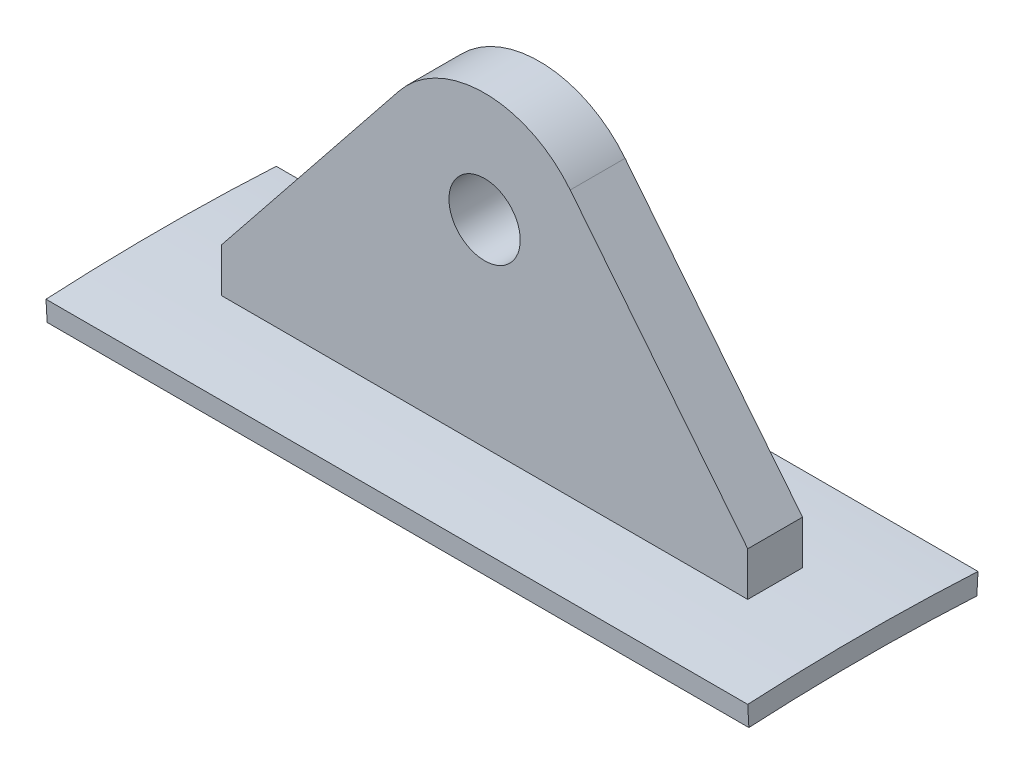
ISO-10303-21;
HEADER;
FILE_DESCRIPTION(('STEP AP214'),'2;1');
FILE_NAME('part.step','',(''),(''),'','','');
FILE_SCHEMA(('AUTOMOTIVE_DESIGN { 1 0 10303 214 1 1 1 1 }'));
ENDSEC;
DATA;
#1=APPLICATION_CONTEXT('core data for automotive mechanical design processes');
#2=APPLICATION_PROTOCOL_DEFINITION('international standard','automotive_design',2000,#1);
#3=PRODUCT_CONTEXT('',#1,'mechanical');
#4=PRODUCT('Part','Part','',(#3));
#5=PRODUCT_RELATED_PRODUCT_CATEGORY('part','',(#4));
#6=PRODUCT_DEFINITION_FORMATION('','',#4);
#7=PRODUCT_DEFINITION_CONTEXT('part definition',#1,'design');
#8=PRODUCT_DEFINITION('design','',#6,#7);
#9=PRODUCT_DEFINITION_SHAPE('','',#8);
#10=(LENGTH_UNIT() NAMED_UNIT(*) SI_UNIT(.MILLI.,.METRE.));
#11=(NAMED_UNIT(*) PLANE_ANGLE_UNIT() SI_UNIT($,.RADIAN.));
#12=(NAMED_UNIT(*) SI_UNIT($,.STERADIAN.) SOLID_ANGLE_UNIT());
#13=UNCERTAINTY_MEASURE_WITH_UNIT(LENGTH_MEASURE(1.E-05),#10,'distance_accuracy_value','');
#14=(GEOMETRIC_REPRESENTATION_CONTEXT(3) GLOBAL_UNCERTAINTY_ASSIGNED_CONTEXT((#13)) GLOBAL_UNIT_ASSIGNED_CONTEXT((#10,
#11,#12)) REPRESENTATION_CONTEXT('',''));
#15=CARTESIAN_POINT('',(0.,0.,0.));
#16=DIRECTION('',(0.,0.,1.));
#17=DIRECTION('',(1.,0.,0.));
#18=AXIS2_PLACEMENT_3D('',#15,#16,#17);
#19=CARTESIAN_POINT('',(203.2,-2.7885816544909,-50.7473544783369));
#20=DIRECTION('',(0.,0.0548675115207372,0.998493643534861));
#21=DIRECTION('',(0.,-0.998493643534861,0.0548675115207372));
#22=AXIS2_PLACEMENT_3D('',#19,#20,#21);
#23=PLANE('',#22);
#24=DIRECTION('',(0.,0.998493643534861,-0.0548675115207372));
#25=VECTOR('',#24,1.);
#26=CARTESIAN_POINT('',(-203.2,-2.7885816544909,-50.7473544783369));
#27=LINE('',#26,#25);
#28=CARTESIAN_POINT('',(-203.2,-13.8124480988553,-50.1415898617511));
#29=VERTEX_POINT('',#28);
#30=CARTESIAN_POINT('',(-203.2,-1.83052437643715,-50.8));
#31=VERTEX_POINT('',#30);
#32=EDGE_CURVE('E110',#29,#31,#27,.T.);
#33=ORIENTED_EDGE('',*,*,#32,.T.);
#34=DIRECTION('',(-1.,0.,0.));
#35=VECTOR('',#34,1.);
#36=CARTESIAN_POINT('',(203.2,-1.83052437643715,-50.8));
#37=LINE('',#36,#35);
#38=CARTESIAN_POINT('',(203.2,-1.83052437643715,-50.8));
#39=VERTEX_POINT('',#38);
#40=EDGE_CURVE('E12',#39,#31,#37,.T.);
#41=ORIENTED_EDGE('',*,*,#40,.F.);
#42=DIRECTION('',(0.,0.998493643534861,-0.0548675115207372));
#43=VECTOR('',#42,1.);
#44=CARTESIAN_POINT('',(203.2,-2.7885816544909,-50.7473544783369));
#45=LINE('',#44,#43);
#46=CARTESIAN_POINT('',(203.2,-13.8124480988553,-50.1415898617511));
#47=VERTEX_POINT('',#46);
#48=EDGE_CURVE('E96',#47,#39,#45,.T.);
#49=ORIENTED_EDGE('',*,*,#48,.F.);
#50=DIRECTION('',(-1.,0.,0.));
#51=VECTOR('',#50,1.);
#52=CARTESIAN_POINT('',(203.2,-13.8124480988553,-50.1415898617511));
#53=LINE('',#52,#51);
#54=EDGE_CURVE('E63',#47,#29,#53,.T.);
#55=ORIENTED_EDGE('',*,*,#54,.T.);
#56=EDGE_LOOP('',(#33,#41,#49,#55));
#57=FACE_BOUND('',#56,.T.);
#58=ADVANCED_FACE('F47',(#57),#23,.F.);
#59=CARTESIAN_POINT('',(203.2,-1215.2,15.8749999999999));
#60=DIRECTION('',(-1.,0.,0.));
#61=DIRECTION('',(0.,0.,1.));
#62=AXIS2_PLACEMENT_3D('',#59,#60,#61);
#63=CYLINDRICAL_SURFACE('',#62,1215.2);
#64=CARTESIAN_POINT('',(-203.2,-1215.2,15.8749999999999));
#65=DIRECTION('',(1.,0.,0.));
#66=DIRECTION('',(0.,0.,-1.));
#67=AXIS2_PLACEMENT_3D('',#64,#65,#66);
#68=CIRCLE('',#67,1215.2);
#69=CARTESIAN_POINT('',(-203.2,-1.83052437643717,82.55));
#70=VERTEX_POINT('',#69);
#71=EDGE_CURVE('E101',#31,#70,#68,.T.);
#72=ORIENTED_EDGE('',*,*,#71,.T.);
#73=DIRECTION('',(-1.,0.,0.));
#74=VECTOR('',#73,1.);
#75=CARTESIAN_POINT('',(203.2,-1.83052437643717,82.55));
#76=LINE('',#75,#74);
#77=CARTESIAN_POINT('',(203.2,-1.83052437643717,82.55));
#78=VERTEX_POINT('',#77);
#79=EDGE_CURVE('E55',#78,#70,#76,.T.);
#80=ORIENTED_EDGE('',*,*,#79,.F.);
#81=CARTESIAN_POINT('',(203.2,-1215.2,15.8749999999999));
#82=DIRECTION('',(1.,0.,0.));
#83=DIRECTION('',(0.,0.,-1.));
#84=AXIS2_PLACEMENT_3D('',#81,#82,#83);
#85=CIRCLE('',#84,1215.2);
#86=EDGE_CURVE('E88',#39,#78,#85,.T.);
#87=ORIENTED_EDGE('',*,*,#86,.F.);
#88=ORIENTED_EDGE('',*,*,#40,.T.);
#89=EDGE_LOOP('',(#72,#80,#87,#88));
#90=FACE_BOUND('',#89,.T.);
#91=ADVANCED_FACE('F100',(#90),#63,.T.);
#92=CARTESIAN_POINT('',(203.2,-4.52800100679943,82.4017728870367));
#93=DIRECTION('',(0.,-0.0548675115207374,0.998493643534861));
#94=DIRECTION('',(0.,-0.998493643534861,-0.0548675115207374));
#95=AXIS2_PLACEMENT_3D('',#92,#93,#94);
#96=PLANE('',#95);
#97=DIRECTION('',(0.,0.998493643534861,0.0548675115207374));
#98=VECTOR('',#97,1.);
#99=CARTESIAN_POINT('',(-203.2,-4.52800100679943,82.4017728870367));
#100=LINE('',#99,#98);
#101=CARTESIAN_POINT('',(-203.2,-13.8124480988553,81.8915898617511));
#102=VERTEX_POINT('',#101);
#103=EDGE_CURVE('E113',#102,#70,#100,.T.);
#104=ORIENTED_EDGE('',*,*,#103,.F.);
#105=DIRECTION('',(-1.,0.,0.));
#106=VECTOR('',#105,1.);
#107=CARTESIAN_POINT('',(203.2,-13.8124480988553,81.8915898617511));
#108=LINE('',#107,#106);
#109=CARTESIAN_POINT('',(203.2,-13.8124480988553,81.8915898617511));
#110=VERTEX_POINT('',#109);
#111=EDGE_CURVE('E77',#110,#102,#108,.T.);
#112=ORIENTED_EDGE('',*,*,#111,.F.);
#113=DIRECTION('',(0.,0.998493643534861,0.0548675115207374));
#114=VECTOR('',#113,1.);
#115=CARTESIAN_POINT('',(203.2,-4.52800100679943,82.4017728870367));
#116=LINE('',#115,#114);
#117=EDGE_CURVE('E95',#110,#78,#116,.T.);
#118=ORIENTED_EDGE('',*,*,#117,.T.);
#119=ORIENTED_EDGE('',*,*,#79,.T.);
#120=EDGE_LOOP('',(#104,#112,#118,#119));
#121=FACE_BOUND('',#120,.T.);
#122=ADVANCED_FACE('F104',(#121),#96,.T.);
#123=CARTESIAN_POINT('',(203.2,-1215.2,15.8749999999999));
#124=DIRECTION('',(-1.,0.,0.));
#125=DIRECTION('',(0.,0.,1.));
#126=AXIS2_PLACEMENT_3D('',#123,#124,#125);
#127=CYLINDRICAL_SURFACE('',#126,1203.2);
#128=CARTESIAN_POINT('',(-203.2,-1215.2,15.8749999999999));
#129=DIRECTION('',(1.,0.,0.));
#130=DIRECTION('',(0.,0.,-1.));
#131=AXIS2_PLACEMENT_3D('',#128,#129,#130);
#132=CIRCLE('',#131,1203.2);
#133=EDGE_CURVE('E115',#29,#102,#132,.T.);
#134=ORIENTED_EDGE('',*,*,#133,.F.);
#135=ORIENTED_EDGE('',*,*,#54,.F.);
#136=CARTESIAN_POINT('',(203.2,-1215.2,15.8749999999999));
#137=DIRECTION('',(1.,0.,0.));
#138=DIRECTION('',(0.,0.,-1.));
#139=AXIS2_PLACEMENT_3D('',#136,#137,#138);
#140=CIRCLE('',#139,1203.2);
#141=EDGE_CURVE('E105',#47,#110,#140,.T.);
#142=ORIENTED_EDGE('',*,*,#141,.T.);
#143=ORIENTED_EDGE('',*,*,#111,.T.);
#144=EDGE_LOOP('',(#134,#135,#142,#143));
#145=FACE_BOUND('',#144,.T.);
#146=ADVANCED_FACE('F121',(#145),#127,.F.);
#147=CARTESIAN_POINT('',(203.2,0.,0.));
#148=DIRECTION('',(1.,0.,0.));
#149=DIRECTION('',(0.,0.,-1.));
#150=AXIS2_PLACEMENT_3D('',#147,#148,#149);
#151=PLANE('',#150);
#152=ORIENTED_EDGE('',*,*,#48,.T.);
#153=ORIENTED_EDGE('',*,*,#86,.T.);
#154=ORIENTED_EDGE('',*,*,#117,.F.);
#155=ORIENTED_EDGE('',*,*,#141,.F.);
#156=EDGE_LOOP('',(#152,#153,#154,#155));
#157=FACE_BOUND('',#156,.T.);
#158=ADVANCED_FACE('F92',(#157),#151,.T.);
#159=CARTESIAN_POINT('',(-203.2,0.,0.));
#160=DIRECTION('',(1.,0.,0.));
#161=DIRECTION('',(0.,0.,-1.));
#162=AXIS2_PLACEMENT_3D('',#159,#160,#161);
#163=PLANE('',#162);
#164=ORIENTED_EDGE('',*,*,#32,.F.);
#165=ORIENTED_EDGE('',*,*,#133,.T.);
#166=ORIENTED_EDGE('',*,*,#103,.T.);
#167=ORIENTED_EDGE('',*,*,#71,.F.);
#168=EDGE_LOOP('',(#164,#165,#166,#167));
#169=FACE_BOUND('',#168,.T.);
#170=ADVANCED_FACE('F120',(#169),#163,.F.);
#171=CLOSED_SHELL('',(#58,#91,#122,#146,#158,#170));
#172=MANIFOLD_SOLID_BREP('B2',#171);
#173=CARTESIAN_POINT('',(0.,114.3,31.75));
#174=DIRECTION('',(0.,0.,1.));
#175=DIRECTION('',(1.,0.,0.));
#176=AXIS2_PLACEMENT_3D('',#173,#174,#175);
#177=PLANE('',#176);
#178=DIRECTION('',(0.,1.,0.));
#179=VECTOR('',#178,1.);
#180=CARTESIAN_POINT('',(152.4,0.,31.75));
#181=LINE('',#180,#179);
#182=CARTESIAN_POINT('',(152.4,0.,31.75));
#183=VERTEX_POINT('',#182);
#184=CARTESIAN_POINT('',(152.4,25.4,31.75));
#185=VERTEX_POINT('',#184);
#186=EDGE_CURVE('E267',#183,#185,#181,.T.);
#187=ORIENTED_EDGE('',*,*,#186,.T.);
#188=DIRECTION('',(-0.624548066123258,0.780986371905233,0.));
#189=VECTOR('',#188,1.);
#190=CARTESIAN_POINT('',(152.4,25.4,31.75));
#191=LINE('',#190,#189);
#192=CARTESIAN_POINT('',(49.5926346159823,153.958802198827,31.75));
#193=VERTEX_POINT('',#192);
#194=EDGE_CURVE('E225',#185,#193,#191,.T.);
#195=ORIENTED_EDGE('',*,*,#194,.T.);
#196=CARTESIAN_POINT('',(0.,114.3,31.75));
#197=DIRECTION('',(0.,0.,1.));
#198=DIRECTION('',(1.,0.,0.));
#199=AXIS2_PLACEMENT_3D('',#196,#197,#198);
#200=CIRCLE('',#199,63.5);
#201=CARTESIAN_POINT('',(-49.5926346159823,153.958802198827,31.75));
#202=VERTEX_POINT('',#201);
#203=EDGE_CURVE('E238',#193,#202,#200,.T.);
#204=ORIENTED_EDGE('',*,*,#203,.T.);
#205=DIRECTION('',(-0.624548066123258,-0.780986371905233,0.));
#206=VECTOR('',#205,1.);
#207=CARTESIAN_POINT('',(-152.4,25.4,31.75));
#208=LINE('',#207,#206);
#209=CARTESIAN_POINT('',(-152.4,25.4,31.75));
#210=VERTEX_POINT('',#209);
#211=EDGE_CURVE('E232',#202,#210,#208,.T.);
#212=ORIENTED_EDGE('',*,*,#211,.T.);
#213=DIRECTION('',(0.,-1.,0.));
#214=VECTOR('',#213,1.);
#215=CARTESIAN_POINT('',(-152.4,0.,31.75));
#216=LINE('',#215,#214);
#217=CARTESIAN_POINT('',(-152.4,0.,31.75));
#218=VERTEX_POINT('',#217);
#219=EDGE_CURVE('E236',#210,#218,#216,.T.);
#220=ORIENTED_EDGE('',*,*,#219,.T.);
#221=DIRECTION('',(1.,0.,0.));
#222=VECTOR('',#221,1.);
#223=CARTESIAN_POINT('',(-152.4,0.,31.75));
#224=LINE('',#223,#222);
#225=EDGE_CURVE('E188',#218,#183,#224,.T.);
#226=ORIENTED_EDGE('',*,*,#225,.T.);
#227=EDGE_LOOP('',(#187,#195,#204,#212,#220,#226));
#228=FACE_BOUND('',#227,.T.);
#229=CARTESIAN_POINT('',(0.,114.3,31.75));
#230=DIRECTION('',(0.,0.,1.));
#231=DIRECTION('',(1.,0.,0.));
#232=AXIS2_PLACEMENT_3D('',#229,#230,#231);
#233=CIRCLE('',#232,20.6375);
#234=CARTESIAN_POINT('',(20.6375,114.3,31.75));
#235=VERTEX_POINT('',#234);
#236=EDGE_CURVE('E260',#235,#235,#233,.T.);
#237=ORIENTED_EDGE('',*,*,#236,.F.);
#238=EDGE_LOOP('',(#237));
#239=FACE_BOUND('',#238,.T.);
#240=ADVANCED_FACE('F171',(#228,#239),#177,.T.);
#241=CARTESIAN_POINT('',(0.,114.3,0.));
#242=DIRECTION('',(0.,0.,1.));
#243=DIRECTION('',(1.,0.,0.));
#244=AXIS2_PLACEMENT_3D('',#241,#242,#243);
#245=PLANE('',#244);
#246=DIRECTION('',(0.,1.,0.));
#247=VECTOR('',#246,1.);
#248=CARTESIAN_POINT('',(152.4,0.,0.));
#249=LINE('',#248,#247);
#250=CARTESIAN_POINT('',(152.4,0.,0.));
#251=VERTEX_POINT('',#250);
#252=CARTESIAN_POINT('',(152.4,25.4,0.));
#253=VERTEX_POINT('',#252);
#254=EDGE_CURVE('E256',#251,#253,#249,.T.);
#255=ORIENTED_EDGE('',*,*,#254,.F.);
#256=DIRECTION('',(1.,0.,0.));
#257=VECTOR('',#256,1.);
#258=CARTESIAN_POINT('',(-152.4,0.,0.));
#259=LINE('',#258,#257);
#260=CARTESIAN_POINT('',(-152.4,0.,0.));
#261=VERTEX_POINT('',#260);
#262=EDGE_CURVE('E217',#261,#251,#259,.T.);
#263=ORIENTED_EDGE('',*,*,#262,.F.);
#264=DIRECTION('',(0.,-1.,0.));
#265=VECTOR('',#264,1.);
#266=CARTESIAN_POINT('',(-152.4,0.,0.));
#267=LINE('',#266,#265);
#268=CARTESIAN_POINT('',(-152.4,25.4,0.));
#269=VERTEX_POINT('',#268);
#270=EDGE_CURVE('E211',#269,#261,#267,.T.);
#271=ORIENTED_EDGE('',*,*,#270,.F.);
#272=DIRECTION('',(-0.624548066123258,-0.780986371905233,0.));
#273=VECTOR('',#272,1.);
#274=CARTESIAN_POINT('',(-152.4,25.4,0.));
#275=LINE('',#274,#273);
#276=CARTESIAN_POINT('',(-49.5926346159823,153.958802198827,0.));
#277=VERTEX_POINT('',#276);
#278=EDGE_CURVE('E246',#277,#269,#275,.T.);
#279=ORIENTED_EDGE('',*,*,#278,.F.);
#280=CARTESIAN_POINT('',(0.,114.3,0.));
#281=DIRECTION('',(0.,0.,1.));
#282=DIRECTION('',(1.,0.,0.));
#283=AXIS2_PLACEMENT_3D('',#280,#281,#282);
#284=CIRCLE('',#283,63.5);
#285=CARTESIAN_POINT('',(49.5926346159823,153.958802198827,0.));
#286=VERTEX_POINT('',#285);
#287=EDGE_CURVE('E262',#286,#277,#284,.T.);
#288=ORIENTED_EDGE('',*,*,#287,.F.);
#289=DIRECTION('',(-0.624548066123258,0.780986371905233,0.));
#290=VECTOR('',#289,1.);
#291=CARTESIAN_POINT('',(152.4,25.4,0.));
#292=LINE('',#291,#290);
#293=EDGE_CURVE('E259',#253,#286,#292,.T.);
#294=ORIENTED_EDGE('',*,*,#293,.F.);
#295=EDGE_LOOP('',(#255,#263,#271,#279,#288,#294));
#296=FACE_BOUND('',#295,.T.);
#297=CARTESIAN_POINT('',(0.,114.3,0.));
#298=DIRECTION('',(0.,0.,1.));
#299=DIRECTION('',(1.,0.,0.));
#300=AXIS2_PLACEMENT_3D('',#297,#298,#299);
#301=CIRCLE('',#300,20.6375);
#302=CARTESIAN_POINT('',(20.6375,114.3,0.));
#303=VERTEX_POINT('',#302);
#304=EDGE_CURVE('E360',#303,#303,#301,.T.);
#305=ORIENTED_EDGE('',*,*,#304,.T.);
#306=EDGE_LOOP('',(#305));
#307=FACE_BOUND('',#306,.T.);
#308=ADVANCED_FACE('F276',(#296,#307),#245,.F.);
#309=CARTESIAN_POINT('',(152.4,0.,31.75));
#310=DIRECTION('',(-1.,0.,0.));
#311=DIRECTION('',(0.,0.,1.));
#312=AXIS2_PLACEMENT_3D('',#309,#310,#311);
#313=PLANE('',#312);
#314=ORIENTED_EDGE('',*,*,#254,.T.);
#315=DIRECTION('',(0.,0.,-1.));
#316=VECTOR('',#315,1.);
#317=CARTESIAN_POINT('',(152.4,25.4,31.75));
#318=LINE('',#317,#316);
#319=EDGE_CURVE('E45',#185,#253,#318,.T.);
#320=ORIENTED_EDGE('',*,*,#319,.F.);
#321=ORIENTED_EDGE('',*,*,#186,.F.);
#322=DIRECTION('',(0.,0.,-1.));
#323=VECTOR('',#322,1.);
#324=CARTESIAN_POINT('',(152.4,0.,31.75));
#325=LINE('',#324,#323);
#326=EDGE_CURVE('E252',#183,#251,#325,.T.);
#327=ORIENTED_EDGE('',*,*,#326,.T.);
#328=EDGE_LOOP('',(#314,#320,#321,#327));
#329=FACE_BOUND('',#328,.T.);
#330=ADVANCED_FACE('F173',(#329),#313,.F.);
#331=CARTESIAN_POINT('',(152.4,25.4,31.75));
#332=DIRECTION('',(-0.780986371905233,-0.624548066123258,0.));
#333=DIRECTION('',(0.624548066123258,-0.780986371905233,0.));
#334=AXIS2_PLACEMENT_3D('',#331,#332,#333);
#335=PLANE('',#334);
#336=ORIENTED_EDGE('',*,*,#293,.T.);
#337=DIRECTION('',(0.,0.,-1.));
#338=VECTOR('',#337,1.);
#339=CARTESIAN_POINT('',(49.5926346159823,153.958802198827,31.75));
#340=LINE('',#339,#338);
#341=EDGE_CURVE('E180',#193,#286,#340,.T.);
#342=ORIENTED_EDGE('',*,*,#341,.F.);
#343=ORIENTED_EDGE('',*,*,#194,.F.);
#344=ORIENTED_EDGE('',*,*,#319,.T.);
#345=EDGE_LOOP('',(#336,#342,#343,#344));
#346=FACE_BOUND('',#345,.T.);
#347=ADVANCED_FACE('F301',(#346),#335,.F.);
#348=CARTESIAN_POINT('',(0.,114.3,31.75));
#349=DIRECTION('',(0.,0.,-1.));
#350=DIRECTION('',(-1.,0.,0.));
#351=AXIS2_PLACEMENT_3D('',#348,#349,#350);
#352=CYLINDRICAL_SURFACE('',#351,63.5);
#353=ORIENTED_EDGE('',*,*,#287,.T.);
#354=DIRECTION('',(0.,0.,-1.));
#355=VECTOR('',#354,1.);
#356=CARTESIAN_POINT('',(-49.5926346159823,153.958802198827,31.75));
#357=LINE('',#356,#355);
#358=EDGE_CURVE('E247',#202,#277,#357,.T.);
#359=ORIENTED_EDGE('',*,*,#358,.F.);
#360=ORIENTED_EDGE('',*,*,#203,.F.);
#361=ORIENTED_EDGE('',*,*,#341,.T.);
#362=EDGE_LOOP('',(#353,#359,#360,#361));
#363=FACE_BOUND('',#362,.T.);
#364=ADVANCED_FACE('F273',(#363),#352,.T.);
#365=CARTESIAN_POINT('',(-152.4,25.4,31.75));
#366=DIRECTION('',(0.780986371905233,-0.624548066123258,0.));
#367=DIRECTION('',(0.624548066123258,0.780986371905233,0.));
#368=AXIS2_PLACEMENT_3D('',#365,#366,#367);
#369=PLANE('',#368);
#370=ORIENTED_EDGE('',*,*,#278,.T.);
#371=DIRECTION('',(0.,0.,-1.));
#372=VECTOR('',#371,1.);
#373=CARTESIAN_POINT('',(-152.4,25.4,31.75));
#374=LINE('',#373,#372);
#375=EDGE_CURVE('E243',#210,#269,#374,.T.);
#376=ORIENTED_EDGE('',*,*,#375,.F.);
#377=ORIENTED_EDGE('',*,*,#211,.F.);
#378=ORIENTED_EDGE('',*,*,#358,.T.);
#379=EDGE_LOOP('',(#370,#376,#377,#378));
#380=FACE_BOUND('',#379,.T.);
#381=ADVANCED_FACE('F244',(#380),#369,.F.);
#382=CARTESIAN_POINT('',(-152.4,0.,31.75));
#383=DIRECTION('',(1.,0.,0.));
#384=DIRECTION('',(0.,0.,-1.));
#385=AXIS2_PLACEMENT_3D('',#382,#383,#384);
#386=PLANE('',#385);
#387=ORIENTED_EDGE('',*,*,#270,.T.);
#388=DIRECTION('',(0.,0.,-1.));
#389=VECTOR('',#388,1.);
#390=CARTESIAN_POINT('',(-152.4,0.,31.75));
#391=LINE('',#390,#389);
#392=EDGE_CURVE('E248',#218,#261,#391,.T.);
#393=ORIENTED_EDGE('',*,*,#392,.F.);
#394=ORIENTED_EDGE('',*,*,#219,.F.);
#395=ORIENTED_EDGE('',*,*,#375,.T.);
#396=EDGE_LOOP('',(#387,#393,#394,#395));
#397=FACE_BOUND('',#396,.T.);
#398=ADVANCED_FACE('F250',(#397),#386,.F.);
#399=CARTESIAN_POINT('',(-152.4,0.,31.75));
#400=DIRECTION('',(0.,1.,0.));
#401=DIRECTION('',(0.,0.,1.));
#402=AXIS2_PLACEMENT_3D('',#399,#400,#401);
#403=PLANE('',#402);
#404=ORIENTED_EDGE('',*,*,#262,.T.);
#405=ORIENTED_EDGE('',*,*,#326,.F.);
#406=ORIENTED_EDGE('',*,*,#225,.F.);
#407=ORIENTED_EDGE('',*,*,#392,.T.);
#408=EDGE_LOOP('',(#404,#405,#406,#407));
#409=FACE_BOUND('',#408,.T.);
#410=ADVANCED_FACE('F281',(#409),#403,.F.);
#411=CARTESIAN_POINT('',(0.,114.3,31.75));
#412=DIRECTION('',(0.,0.,-1.));
#413=DIRECTION('',(-1.,0.,0.));
#414=AXIS2_PLACEMENT_3D('',#411,#412,#413);
#415=CYLINDRICAL_SURFACE('',#414,20.6375);
#416=ORIENTED_EDGE('',*,*,#236,.T.);
#417=EDGE_LOOP('',(#416));
#418=FACE_BOUND('',#417,.T.);
#419=ORIENTED_EDGE('',*,*,#304,.F.);
#420=EDGE_LOOP('',(#419));
#421=FACE_BOUND('',#420,.T.);
#422=ADVANCED_FACE('F283',(#418,#421),#415,.F.);
#423=CLOSED_SHELL('',(#240,#308,#330,#347,#364,#381,#398,#410,#422));
#424=MANIFOLD_SOLID_BREP('B6',#423);
#425=ADVANCED_BREP_SHAPE_REPRESENTATION('',(#18,#172,#424),#14);
#426=SHAPE_DEFINITION_REPRESENTATION(#9,#425);
ENDSEC;
END-ISO-10303-21;
